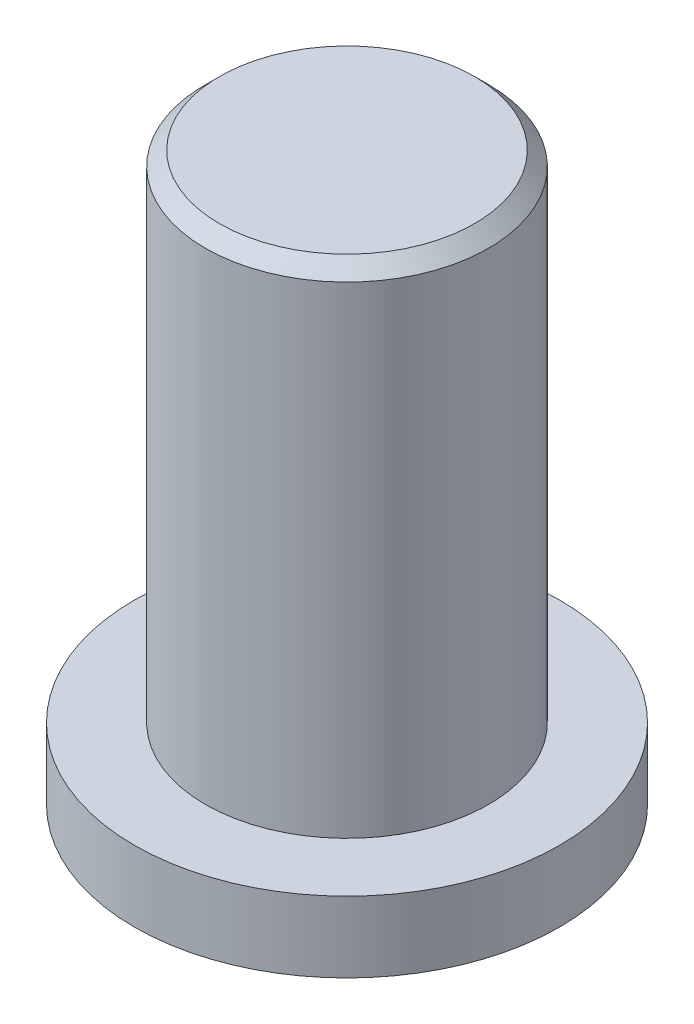
ISO-10303-21;
HEADER;
FILE_DESCRIPTION(('STEP AP214'),'2;1');
FILE_NAME('part.step','',(''),(''),'','','');
FILE_SCHEMA(('AUTOMOTIVE_DESIGN { 1 0 10303 214 1 1 1 1 }'));
ENDSEC;
DATA;
#1=APPLICATION_CONTEXT('core data for automotive mechanical design processes');
#2=APPLICATION_PROTOCOL_DEFINITION('international standard','automotive_design',2000,#1);
#3=PRODUCT_CONTEXT('',#1,'mechanical');
#4=PRODUCT('Part','Part','',(#3));
#5=PRODUCT_RELATED_PRODUCT_CATEGORY('part','',(#4));
#6=PRODUCT_DEFINITION_FORMATION('','',#4);
#7=PRODUCT_DEFINITION_CONTEXT('part definition',#1,'design');
#8=PRODUCT_DEFINITION('design','',#6,#7);
#9=PRODUCT_DEFINITION_SHAPE('','',#8);
#10=(LENGTH_UNIT() NAMED_UNIT(*) SI_UNIT(.MILLI.,.METRE.));
#11=(NAMED_UNIT(*) PLANE_ANGLE_UNIT() SI_UNIT($,.RADIAN.));
#12=(NAMED_UNIT(*) SI_UNIT($,.STERADIAN.) SOLID_ANGLE_UNIT());
#13=UNCERTAINTY_MEASURE_WITH_UNIT(LENGTH_MEASURE(1.E-05),#10,'distance_accuracy_value','');
#14=(GEOMETRIC_REPRESENTATION_CONTEXT(3) GLOBAL_UNCERTAINTY_ASSIGNED_CONTEXT((#13)) GLOBAL_UNIT_ASSIGNED_CONTEXT((#10,
#11,#12)) REPRESENTATION_CONTEXT('',''));
#15=CARTESIAN_POINT('',(0.,0.,0.));
#16=DIRECTION('',(0.,0.,1.));
#17=DIRECTION('',(1.,0.,0.));
#18=AXIS2_PLACEMENT_3D('',#15,#16,#17);
#19=CARTESIAN_POINT('',(15.,0.,0.));
#20=DIRECTION('',(0.,1.,0.));
#21=DIRECTION('',(0.,0.,1.));
#22=AXIS2_PLACEMENT_3D('',#19,#20,#21);
#23=PLANE('',#22);
#24=CARTESIAN_POINT('',(0.,0.,0.));
#25=DIRECTION('',(0.,1.,0.));
#26=DIRECTION('',(0.,0.,1.));
#27=AXIS2_PLACEMENT_3D('',#24,#25,#26);
#28=CIRCLE('',#27,15.);
#29=CARTESIAN_POINT('',(0.,0.,15.));
#30=VERTEX_POINT('',#29);
#31=EDGE_CURVE('E62',#30,#30,#28,.T.);
#32=ORIENTED_EDGE('',*,*,#31,.F.);
#33=EDGE_LOOP('',(#32));
#34=FACE_BOUND('',#33,.T.);
#35=ADVANCED_FACE('F38',(#34),#23,.F.);
#36=CARTESIAN_POINT('',(0.,40.,0.));
#37=DIRECTION('',(0.,-1.,0.));
#38=DIRECTION('',(0.,0.,-1.));
#39=AXIS2_PLACEMENT_3D('',#36,#37,#38);
#40=PLANE('',#39);
#41=CARTESIAN_POINT('',(0.,40.,0.));
#42=DIRECTION('',(0.,-1.,0.));
#43=DIRECTION('',(0.,0.,-1.));
#44=AXIS2_PLACEMENT_3D('',#41,#42,#43);
#45=CIRCLE('',#44,8.99999999999999);
#46=CARTESIAN_POINT('',(0.,40.,-8.99999999999999));
#47=VERTEX_POINT('',#46);
#48=EDGE_CURVE('E46',#47,#47,#45,.F.);
#49=ORIENTED_EDGE('',*,*,#48,.T.);
#50=EDGE_LOOP('',(#49));
#51=FACE_BOUND('',#50,.T.);
#52=ADVANCED_FACE('F70',(#51),#40,.F.);
#53=CARTESIAN_POINT('',(0.,28.716577540107,0.));
#54=DIRECTION('',(0.,1.,0.));
#55=DIRECTION('',(0.,0.,1.));
#56=AXIS2_PLACEMENT_3D('',#53,#54,#55);
#57=CYLINDRICAL_SURFACE('',#56,9.99999999999999);
#58=CARTESIAN_POINT('',(0.,39.,0.));
#59=DIRECTION('',(0.,-1.,0.));
#60=DIRECTION('',(0.,0.,-1.));
#61=AXIS2_PLACEMENT_3D('',#58,#59,#60);
#62=CIRCLE('',#61,9.99999999999999);
#63=CARTESIAN_POINT('',(0.,39.,-9.99999999999999));
#64=VERTEX_POINT('',#63);
#65=EDGE_CURVE('E10',#64,#64,#62,.T.);
#66=ORIENTED_EDGE('',*,*,#65,.T.);
#67=EDGE_LOOP('',(#66));
#68=FACE_BOUND('',#67,.T.);
#69=CARTESIAN_POINT('',(0.,5.,0.));
#70=DIRECTION('',(0.,1.,0.));
#71=DIRECTION('',(0.,0.,1.));
#72=AXIS2_PLACEMENT_3D('',#69,#70,#71);
#73=CIRCLE('',#72,10.);
#74=CARTESIAN_POINT('',(0.,5.,10.));
#75=VERTEX_POINT('',#74);
#76=EDGE_CURVE('E51',#75,#75,#73,.T.);
#77=ORIENTED_EDGE('',*,*,#76,.T.);
#78=EDGE_LOOP('',(#77));
#79=FACE_BOUND('',#78,.T.);
#80=ADVANCED_FACE('F74',(#68,#79),#57,.T.);
#81=CARTESIAN_POINT('',(10.,5.,0.));
#82=DIRECTION('',(0.,-1.,0.));
#83=DIRECTION('',(0.,0.,-1.));
#84=AXIS2_PLACEMENT_3D('',#81,#82,#83);
#85=PLANE('',#84);
#86=ORIENTED_EDGE('',*,*,#76,.F.);
#87=EDGE_LOOP('',(#86));
#88=FACE_BOUND('',#87,.T.);
#89=CARTESIAN_POINT('',(0.,5.,0.));
#90=DIRECTION('',(0.,1.,0.));
#91=DIRECTION('',(0.,0.,1.));
#92=AXIS2_PLACEMENT_3D('',#89,#90,#91);
#93=CIRCLE('',#92,15.);
#94=CARTESIAN_POINT('',(0.,5.,15.));
#95=VERTEX_POINT('',#94);
#96=EDGE_CURVE('E56',#95,#95,#93,.T.);
#97=ORIENTED_EDGE('',*,*,#96,.T.);
#98=EDGE_LOOP('',(#97));
#99=FACE_BOUND('',#98,.T.);
#100=ADVANCED_FACE('F79',(#88,#99),#85,.F.);
#101=CARTESIAN_POINT('',(0.,28.716577540107,0.));
#102=DIRECTION('',(0.,1.,0.));
#103=DIRECTION('',(0.,0.,1.));
#104=AXIS2_PLACEMENT_3D('',#101,#102,#103);
#105=CYLINDRICAL_SURFACE('',#104,15.);
#106=ORIENTED_EDGE('',*,*,#96,.F.);
#107=EDGE_LOOP('',(#106));
#108=FACE_BOUND('',#107,.T.);
#109=ORIENTED_EDGE('',*,*,#31,.T.);
#110=EDGE_LOOP('',(#109));
#111=FACE_BOUND('',#110,.T.);
#112=ADVANCED_FACE('F67',(#108,#111),#105,.T.);
#113=CARTESIAN_POINT('',(0.,40.,0.));
#114=DIRECTION('',(0.,-1.,0.));
#115=DIRECTION('',(0.,0.,-1.));
#116=AXIS2_PLACEMENT_3D('',#113,#114,#115);
#117=CONICAL_SURFACE('',#116,8.99999999999999,0.785398163397448);
#118=ORIENTED_EDGE('',*,*,#65,.F.);
#119=EDGE_LOOP('',(#118));
#120=FACE_BOUND('',#119,.T.);
#121=ORIENTED_EDGE('',*,*,#48,.F.);
#122=EDGE_LOOP('',(#121));
#123=FACE_BOUND('',#122,.T.);
#124=ADVANCED_FACE('F40',(#120,#123),#117,.T.);
#125=CLOSED_SHELL('',(#35,#52,#80,#100,#112,#124));
#126=MANIFOLD_SOLID_BREP('B2',#125);
#127=ADVANCED_BREP_SHAPE_REPRESENTATION('',(#18,#126),#14);
#128=SHAPE_DEFINITION_REPRESENTATION(#9,#127);
ENDSEC;
END-ISO-10303-21;
